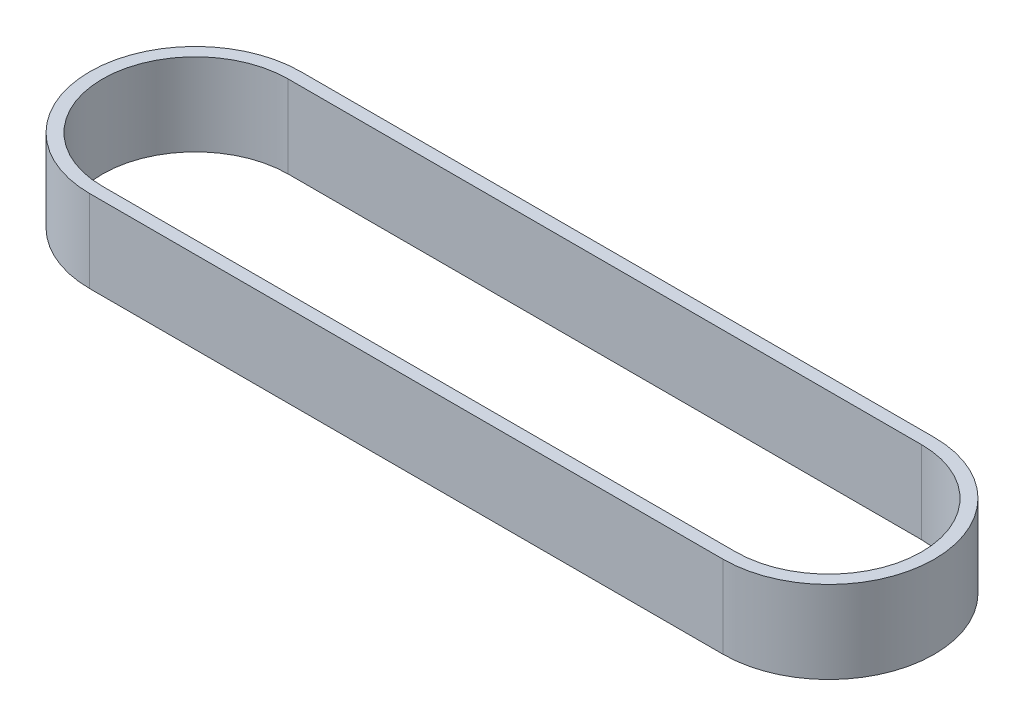
ISO-10303-21;
HEADER;
FILE_DESCRIPTION(('STEP AP214'),'2;1');
FILE_NAME('part.step','',(''),(''),'','','');
FILE_SCHEMA(('AUTOMOTIVE_DESIGN { 1 0 10303 214 1 1 1 1 }'));
ENDSEC;
DATA;
#1=APPLICATION_CONTEXT('core data for automotive mechanical design processes');
#2=APPLICATION_PROTOCOL_DEFINITION('international standard','automotive_design',2000,#1);
#3=PRODUCT_CONTEXT('',#1,'mechanical');
#4=PRODUCT('Part','Part','',(#3));
#5=PRODUCT_RELATED_PRODUCT_CATEGORY('part','',(#4));
#6=PRODUCT_DEFINITION_FORMATION('','',#4);
#7=PRODUCT_DEFINITION_CONTEXT('part definition',#1,'design');
#8=PRODUCT_DEFINITION('design','',#6,#7);
#9=PRODUCT_DEFINITION_SHAPE('','',#8);
#10=(LENGTH_UNIT() NAMED_UNIT(*) SI_UNIT(.MILLI.,.METRE.));
#11=(NAMED_UNIT(*) PLANE_ANGLE_UNIT() SI_UNIT($,.RADIAN.));
#12=(NAMED_UNIT(*) SI_UNIT($,.STERADIAN.) SOLID_ANGLE_UNIT());
#13=UNCERTAINTY_MEASURE_WITH_UNIT(LENGTH_MEASURE(1.E-05),#10,'distance_accuracy_value','');
#14=(GEOMETRIC_REPRESENTATION_CONTEXT(3) GLOBAL_UNCERTAINTY_ASSIGNED_CONTEXT((#13)) GLOBAL_UNIT_ASSIGNED_CONTEXT((#10,
#11,#12)) REPRESENTATION_CONTEXT('',''));
#15=CARTESIAN_POINT('',(0.,0.,0.));
#16=DIRECTION('',(0.,0.,1.));
#17=DIRECTION('',(1.,0.,0.));
#18=AXIS2_PLACEMENT_3D('',#15,#16,#17);
#19=CARTESIAN_POINT('',(-150.,39.,0.));
#20=DIRECTION('',(0.,1.,0.));
#21=DIRECTION('',(0.,0.,1.));
#22=AXIS2_PLACEMENT_3D('',#19,#20,#21);
#23=PLANE('',#22);
#24=CARTESIAN_POINT('',(-150.,39.,0.));
#25=DIRECTION('',(0.,1.,0.));
#26=DIRECTION('',(0.,0.,1.));
#27=AXIS2_PLACEMENT_3D('',#24,#25,#26);
#28=CIRCLE('',#27,50.);
#29=CARTESIAN_POINT('',(-150.,39.,-50.));
#30=VERTEX_POINT('',#29);
#31=CARTESIAN_POINT('',(-150.,39.,50.));
#32=VERTEX_POINT('',#31);
#33=EDGE_CURVE('E136',#30,#32,#28,.T.);
#34=ORIENTED_EDGE('',*,*,#33,.T.);
#35=DIRECTION('',(1.,0.,0.));
#36=VECTOR('',#35,1.);
#37=CARTESIAN_POINT('',(-150.,39.,50.));
#38=LINE('',#37,#36);
#39=CARTESIAN_POINT('',(150.,39.,50.));
#40=VERTEX_POINT('',#39);
#41=EDGE_CURVE('E139',#32,#40,#38,.T.);
#42=ORIENTED_EDGE('',*,*,#41,.T.);
#43=CARTESIAN_POINT('',(150.,39.,0.));
#44=DIRECTION('',(0.,1.,0.));
#45=DIRECTION('',(0.,0.,1.));
#46=AXIS2_PLACEMENT_3D('',#43,#44,#45);
#47=CIRCLE('',#46,50.);
#48=CARTESIAN_POINT('',(150.,39.,-50.));
#49=VERTEX_POINT('',#48);
#50=EDGE_CURVE('E142',#40,#49,#47,.T.);
#51=ORIENTED_EDGE('',*,*,#50,.T.);
#52=DIRECTION('',(-1.,0.,0.));
#53=VECTOR('',#52,1.);
#54=CARTESIAN_POINT('',(-150.,39.,-50.));
#55=LINE('',#54,#53);
#56=EDGE_CURVE('E144',#49,#30,#55,.T.);
#57=ORIENTED_EDGE('',*,*,#56,.T.);
#58=EDGE_LOOP('',(#34,#42,#51,#57));
#59=FACE_BOUND('',#58,.T.);
#60=DIRECTION('',(1.,0.,0.));
#61=VECTOR('',#60,1.);
#62=CARTESIAN_POINT('',(-150.,39.,44.));
#63=LINE('',#62,#61);
#64=CARTESIAN_POINT('',(-150.,39.,44.));
#65=VERTEX_POINT('',#64);
#66=CARTESIAN_POINT('',(150.,39.,44.));
#67=VERTEX_POINT('',#66);
#68=EDGE_CURVE('E108',#65,#67,#63,.T.);
#69=ORIENTED_EDGE('',*,*,#68,.F.);
#70=CARTESIAN_POINT('',(-150.,39.,0.));
#71=DIRECTION('',(0.,1.,0.));
#72=DIRECTION('',(0.,0.,1.));
#73=AXIS2_PLACEMENT_3D('',#70,#71,#72);
#74=CIRCLE('',#73,44.);
#75=CARTESIAN_POINT('',(-150.,39.,-44.));
#76=VERTEX_POINT('',#75);
#77=EDGE_CURVE('E100',#76,#65,#74,.T.);
#78=ORIENTED_EDGE('',*,*,#77,.F.);
#79=DIRECTION('',(-1.,0.,0.));
#80=VECTOR('',#79,1.);
#81=CARTESIAN_POINT('',(-150.,39.,-44.));
#82=LINE('',#81,#80);
#83=CARTESIAN_POINT('',(150.,39.,-44.));
#84=VERTEX_POINT('',#83);
#85=EDGE_CURVE('E122',#84,#76,#82,.T.);
#86=ORIENTED_EDGE('',*,*,#85,.F.);
#87=CARTESIAN_POINT('',(150.,39.,0.));
#88=DIRECTION('',(0.,1.,0.));
#89=DIRECTION('',(0.,0.,1.));
#90=AXIS2_PLACEMENT_3D('',#87,#88,#89);
#91=CIRCLE('',#90,44.);
#92=EDGE_CURVE('E120',#67,#84,#91,.T.);
#93=ORIENTED_EDGE('',*,*,#92,.F.);
#94=EDGE_LOOP('',(#69,#78,#86,#93));
#95=FACE_BOUND('',#94,.T.);
#96=ADVANCED_FACE('F35',(#59,#95),#23,.T.);
#97=CARTESIAN_POINT('',(-150.,0.,0.));
#98=DIRECTION('',(0.,1.,0.));
#99=DIRECTION('',(0.,0.,1.));
#100=AXIS2_PLACEMENT_3D('',#97,#98,#99);
#101=PLANE('',#100);
#102=CARTESIAN_POINT('',(-150.,0.,0.));
#103=DIRECTION('',(0.,1.,0.));
#104=DIRECTION('',(0.,0.,1.));
#105=AXIS2_PLACEMENT_3D('',#102,#103,#104);
#106=CIRCLE('',#105,50.);
#107=CARTESIAN_POINT('',(-150.,0.,-50.));
#108=VERTEX_POINT('',#107);
#109=CARTESIAN_POINT('',(-150.,0.,50.));
#110=VERTEX_POINT('',#109);
#111=EDGE_CURVE('E116',#108,#110,#106,.T.);
#112=ORIENTED_EDGE('',*,*,#111,.F.);
#113=DIRECTION('',(-1.,0.,0.));
#114=VECTOR('',#113,1.);
#115=CARTESIAN_POINT('',(-150.,0.,-50.));
#116=LINE('',#115,#114);
#117=CARTESIAN_POINT('',(150.,0.,-50.));
#118=VERTEX_POINT('',#117);
#119=EDGE_CURVE('E140',#118,#108,#116,.T.);
#120=ORIENTED_EDGE('',*,*,#119,.F.);
#121=CARTESIAN_POINT('',(150.,0.,0.));
#122=DIRECTION('',(0.,1.,0.));
#123=DIRECTION('',(0.,0.,1.));
#124=AXIS2_PLACEMENT_3D('',#121,#122,#123);
#125=CIRCLE('',#124,50.);
#126=CARTESIAN_POINT('',(150.,0.,50.));
#127=VERTEX_POINT('',#126);
#128=EDGE_CURVE('E151',#127,#118,#125,.T.);
#129=ORIENTED_EDGE('',*,*,#128,.F.);
#130=DIRECTION('',(1.,0.,0.));
#131=VECTOR('',#130,1.);
#132=CARTESIAN_POINT('',(-150.,0.,50.));
#133=LINE('',#132,#131);
#134=EDGE_CURVE('E149',#110,#127,#133,.T.);
#135=ORIENTED_EDGE('',*,*,#134,.F.);
#136=EDGE_LOOP('',(#112,#120,#129,#135));
#137=FACE_BOUND('',#136,.T.);
#138=CARTESIAN_POINT('',(-150.,0.,0.));
#139=DIRECTION('',(0.,1.,0.));
#140=DIRECTION('',(0.,0.,1.));
#141=AXIS2_PLACEMENT_3D('',#138,#139,#140);
#142=CIRCLE('',#141,44.);
#143=CARTESIAN_POINT('',(-150.,0.,-44.));
#144=VERTEX_POINT('',#143);
#145=CARTESIAN_POINT('',(-150.,0.,44.));
#146=VERTEX_POINT('',#145);
#147=EDGE_CURVE('E58',#144,#146,#142,.T.);
#148=ORIENTED_EDGE('',*,*,#147,.T.);
#149=DIRECTION('',(1.,0.,0.));
#150=VECTOR('',#149,1.);
#151=CARTESIAN_POINT('',(-150.,0.,44.));
#152=LINE('',#151,#150);
#153=CARTESIAN_POINT('',(150.,0.,44.));
#154=VERTEX_POINT('',#153);
#155=EDGE_CURVE('E115',#146,#154,#152,.T.);
#156=ORIENTED_EDGE('',*,*,#155,.T.);
#157=CARTESIAN_POINT('',(150.,0.,0.));
#158=DIRECTION('',(0.,1.,0.));
#159=DIRECTION('',(0.,0.,1.));
#160=AXIS2_PLACEMENT_3D('',#157,#158,#159);
#161=CIRCLE('',#160,44.);
#162=CARTESIAN_POINT('',(150.,0.,-44.));
#163=VERTEX_POINT('',#162);
#164=EDGE_CURVE('E128',#154,#163,#161,.T.);
#165=ORIENTED_EDGE('',*,*,#164,.T.);
#166=DIRECTION('',(-1.,0.,0.));
#167=VECTOR('',#166,1.);
#168=CARTESIAN_POINT('',(-150.,0.,-44.));
#169=LINE('',#168,#167);
#170=EDGE_CURVE('E109',#163,#144,#169,.T.);
#171=ORIENTED_EDGE('',*,*,#170,.T.);
#172=EDGE_LOOP('',(#148,#156,#165,#171));
#173=FACE_BOUND('',#172,.T.);
#174=ADVANCED_FACE('F169',(#137,#173),#101,.F.);
#175=CARTESIAN_POINT('',(-150.,39.,0.));
#176=DIRECTION('',(0.,-1.,0.));
#177=DIRECTION('',(0.,0.,-1.));
#178=AXIS2_PLACEMENT_3D('',#175,#176,#177);
#179=CYLINDRICAL_SURFACE('',#178,50.);
#180=ORIENTED_EDGE('',*,*,#111,.T.);
#181=DIRECTION('',(0.,-1.,0.));
#182=VECTOR('',#181,1.);
#183=CARTESIAN_POINT('',(-150.,39.,50.));
#184=LINE('',#183,#182);
#185=EDGE_CURVE('E11',#32,#110,#184,.T.);
#186=ORIENTED_EDGE('',*,*,#185,.F.);
#187=ORIENTED_EDGE('',*,*,#33,.F.);
#188=DIRECTION('',(0.,-1.,0.));
#189=VECTOR('',#188,1.);
#190=CARTESIAN_POINT('',(-150.,39.,-50.));
#191=LINE('',#190,#189);
#192=EDGE_CURVE('E146',#30,#108,#191,.T.);
#193=ORIENTED_EDGE('',*,*,#192,.T.);
#194=EDGE_LOOP('',(#180,#186,#187,#193));
#195=FACE_BOUND('',#194,.T.);
#196=ADVANCED_FACE('F37',(#195),#179,.T.);
#197=CARTESIAN_POINT('',(-150.,39.,50.));
#198=DIRECTION('',(0.,0.,-1.));
#199=DIRECTION('',(-1.,0.,0.));
#200=AXIS2_PLACEMENT_3D('',#197,#198,#199);
#201=PLANE('',#200);
#202=ORIENTED_EDGE('',*,*,#134,.T.);
#203=DIRECTION('',(0.,-1.,0.));
#204=VECTOR('',#203,1.);
#205=CARTESIAN_POINT('',(150.,39.,50.));
#206=LINE('',#205,#204);
#207=EDGE_CURVE('E43',#40,#127,#206,.T.);
#208=ORIENTED_EDGE('',*,*,#207,.F.);
#209=ORIENTED_EDGE('',*,*,#41,.F.);
#210=ORIENTED_EDGE('',*,*,#185,.T.);
#211=EDGE_LOOP('',(#202,#208,#209,#210));
#212=FACE_BOUND('',#211,.T.);
#213=ADVANCED_FACE('F179',(#212),#201,.F.);
#214=CARTESIAN_POINT('',(150.,39.,0.));
#215=DIRECTION('',(0.,-1.,0.));
#216=DIRECTION('',(0.,0.,-1.));
#217=AXIS2_PLACEMENT_3D('',#214,#215,#216);
#218=CYLINDRICAL_SURFACE('',#217,50.);
#219=ORIENTED_EDGE('',*,*,#128,.T.);
#220=DIRECTION('',(0.,-1.,0.));
#221=VECTOR('',#220,1.);
#222=CARTESIAN_POINT('',(150.,39.,-50.));
#223=LINE('',#222,#221);
#224=EDGE_CURVE('E156',#49,#118,#223,.T.);
#225=ORIENTED_EDGE('',*,*,#224,.F.);
#226=ORIENTED_EDGE('',*,*,#50,.F.);
#227=ORIENTED_EDGE('',*,*,#207,.T.);
#228=EDGE_LOOP('',(#219,#225,#226,#227));
#229=FACE_BOUND('',#228,.T.);
#230=ADVANCED_FACE('F163',(#229),#218,.T.);
#231=CARTESIAN_POINT('',(-150.,39.,-50.));
#232=DIRECTION('',(0.,0.,1.));
#233=DIRECTION('',(1.,0.,0.));
#234=AXIS2_PLACEMENT_3D('',#231,#232,#233);
#235=PLANE('',#234);
#236=ORIENTED_EDGE('',*,*,#119,.T.);
#237=ORIENTED_EDGE('',*,*,#192,.F.);
#238=ORIENTED_EDGE('',*,*,#56,.F.);
#239=ORIENTED_EDGE('',*,*,#224,.T.);
#240=EDGE_LOOP('',(#236,#237,#238,#239));
#241=FACE_BOUND('',#240,.T.);
#242=ADVANCED_FACE('F173',(#241),#235,.F.);
#243=CARTESIAN_POINT('',(-150.,39.,0.));
#244=DIRECTION('',(0.,-1.,0.));
#245=DIRECTION('',(0.,0.,-1.));
#246=AXIS2_PLACEMENT_3D('',#243,#244,#245);
#247=CYLINDRICAL_SURFACE('',#246,44.);
#248=ORIENTED_EDGE('',*,*,#147,.F.);
#249=DIRECTION('',(0.,-1.,0.));
#250=VECTOR('',#249,1.);
#251=CARTESIAN_POINT('',(-150.,39.,-44.));
#252=LINE('',#251,#250);
#253=EDGE_CURVE('E104',#76,#144,#252,.T.);
#254=ORIENTED_EDGE('',*,*,#253,.F.);
#255=ORIENTED_EDGE('',*,*,#77,.T.);
#256=DIRECTION('',(0.,-1.,0.));
#257=VECTOR('',#256,1.);
#258=CARTESIAN_POINT('',(-150.,39.,44.));
#259=LINE('',#258,#257);
#260=EDGE_CURVE('E103',#65,#146,#259,.T.);
#261=ORIENTED_EDGE('',*,*,#260,.T.);
#262=EDGE_LOOP('',(#248,#254,#255,#261));
#263=FACE_BOUND('',#262,.T.);
#264=ADVANCED_FACE('F102',(#263),#247,.F.);
#265=CARTESIAN_POINT('',(-150.,39.,44.));
#266=DIRECTION('',(0.,0.,-1.));
#267=DIRECTION('',(-1.,0.,0.));
#268=AXIS2_PLACEMENT_3D('',#265,#266,#267);
#269=PLANE('',#268);
#270=ORIENTED_EDGE('',*,*,#155,.F.);
#271=ORIENTED_EDGE('',*,*,#260,.F.);
#272=ORIENTED_EDGE('',*,*,#68,.T.);
#273=DIRECTION('',(0.,-1.,0.));
#274=VECTOR('',#273,1.);
#275=CARTESIAN_POINT('',(150.,39.,44.));
#276=LINE('',#275,#274);
#277=EDGE_CURVE('E117',#67,#154,#276,.T.);
#278=ORIENTED_EDGE('',*,*,#277,.T.);
#279=EDGE_LOOP('',(#270,#271,#272,#278));
#280=FACE_BOUND('',#279,.T.);
#281=ADVANCED_FACE('F112',(#280),#269,.T.);
#282=CARTESIAN_POINT('',(150.,39.,0.));
#283=DIRECTION('',(0.,-1.,0.));
#284=DIRECTION('',(0.,0.,-1.));
#285=AXIS2_PLACEMENT_3D('',#282,#283,#284);
#286=CYLINDRICAL_SURFACE('',#285,44.);
#287=ORIENTED_EDGE('',*,*,#164,.F.);
#288=ORIENTED_EDGE('',*,*,#277,.F.);
#289=ORIENTED_EDGE('',*,*,#92,.T.);
#290=DIRECTION('',(0.,-1.,0.));
#291=VECTOR('',#290,1.);
#292=CARTESIAN_POINT('',(150.,39.,-44.));
#293=LINE('',#292,#291);
#294=EDGE_CURVE('E50',#84,#163,#293,.T.);
#295=ORIENTED_EDGE('',*,*,#294,.T.);
#296=EDGE_LOOP('',(#287,#288,#289,#295));
#297=FACE_BOUND('',#296,.T.);
#298=ADVANCED_FACE('F202',(#297),#286,.F.);
#299=CARTESIAN_POINT('',(-150.,39.,-44.));
#300=DIRECTION('',(0.,0.,1.));
#301=DIRECTION('',(1.,0.,0.));
#302=AXIS2_PLACEMENT_3D('',#299,#300,#301);
#303=PLANE('',#302);
#304=ORIENTED_EDGE('',*,*,#170,.F.);
#305=ORIENTED_EDGE('',*,*,#294,.F.);
#306=ORIENTED_EDGE('',*,*,#85,.T.);
#307=ORIENTED_EDGE('',*,*,#253,.T.);
#308=EDGE_LOOP('',(#304,#305,#306,#307));
#309=FACE_BOUND('',#308,.T.);
#310=ADVANCED_FACE('F206',(#309),#303,.T.);
#311=CLOSED_SHELL('',(#96,#174,#196,#213,#230,#242,#264,#281,#298,#310));
#312=MANIFOLD_SOLID_BREP('B2',#311);
#313=ADVANCED_BREP_SHAPE_REPRESENTATION('',(#18,#312),#14);
#314=SHAPE_DEFINITION_REPRESENTATION(#9,#313);
ENDSEC;
END-ISO-10303-21;
